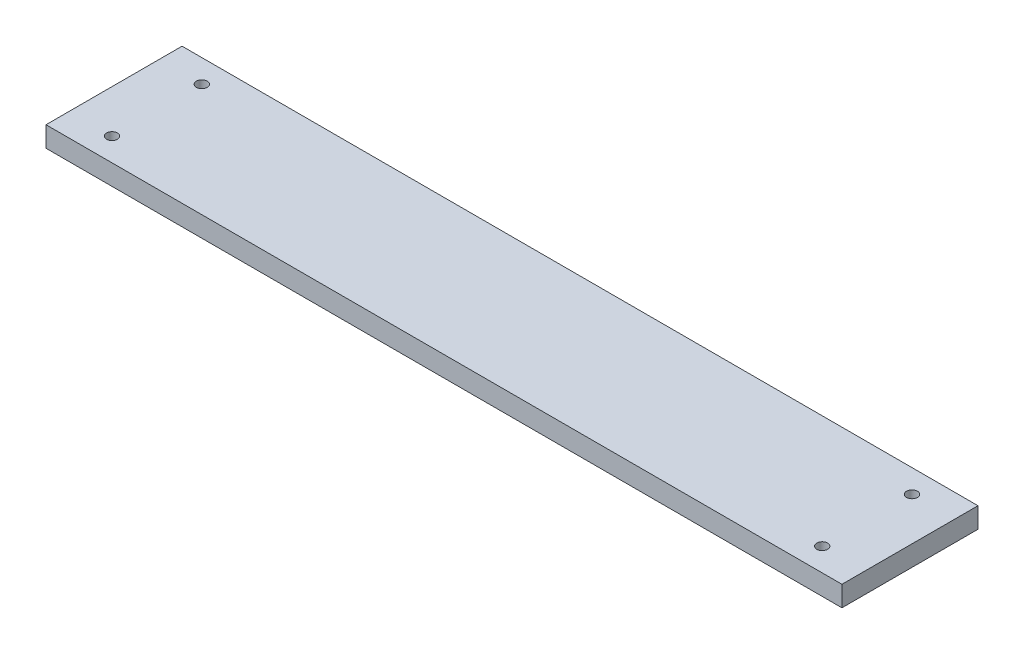
ISO-10303-21;
HEADER;
FILE_DESCRIPTION(('STEP AP214'),'2;1');
FILE_NAME('part.step','',(''),(''),'','','');
FILE_SCHEMA(('AUTOMOTIVE_DESIGN { 1 0 10303 214 1 1 1 1 }'));
ENDSEC;
DATA;
#1=APPLICATION_CONTEXT('core data for automotive mechanical design processes');
#2=APPLICATION_PROTOCOL_DEFINITION('international standard','automotive_design',2000,#1);
#3=PRODUCT_CONTEXT('',#1,'mechanical');
#4=PRODUCT('Part','Part','',(#3));
#5=PRODUCT_RELATED_PRODUCT_CATEGORY('part','',(#4));
#6=PRODUCT_DEFINITION_FORMATION('','',#4);
#7=PRODUCT_DEFINITION_CONTEXT('part definition',#1,'design');
#8=PRODUCT_DEFINITION('design','',#6,#7);
#9=PRODUCT_DEFINITION_SHAPE('','',#8);
#10=(LENGTH_UNIT() NAMED_UNIT(*) SI_UNIT(.MILLI.,.METRE.));
#11=(NAMED_UNIT(*) PLANE_ANGLE_UNIT() SI_UNIT($,.RADIAN.));
#12=(NAMED_UNIT(*) SI_UNIT($,.STERADIAN.) SOLID_ANGLE_UNIT());
#13=UNCERTAINTY_MEASURE_WITH_UNIT(LENGTH_MEASURE(1.E-05),#10,'distance_accuracy_value','');
#14=(GEOMETRIC_REPRESENTATION_CONTEXT(3) GLOBAL_UNCERTAINTY_ASSIGNED_CONTEXT((#13)) GLOBAL_UNIT_ASSIGNED_CONTEXT((#10,
#11,#12)) REPRESENTATION_CONTEXT('',''));
#15=CARTESIAN_POINT('',(0.,0.,0.));
#16=DIRECTION('',(0.,0.,1.));
#17=DIRECTION('',(1.,0.,0.));
#18=AXIS2_PLACEMENT_3D('',#15,#16,#17);
#19=CARTESIAN_POINT('',(0.,15.,0.));
#20=DIRECTION('',(0.,-1.,0.));
#21=DIRECTION('',(0.,0.,-1.));
#22=AXIS2_PLACEMENT_3D('',#19,#20,#21);
#23=PLANE('',#22);
#24=CARTESIAN_POINT('',(553.5,15.,-17.));
#25=DIRECTION('',(0.,1.,0.));
#26=DIRECTION('',(0.,0.,-1.));
#27=AXIS2_PLACEMENT_3D('',#24,#25,#26);
#28=CIRCLE('',#27,3.99999999999999);
#29=CARTESIAN_POINT('',(553.5,15.,-21.));
#30=VERTEX_POINT('',#29);
#31=EDGE_CURVE('E121',#30,#30,#28,.T.);
#32=ORIENTED_EDGE('',*,*,#31,.F.);
#33=EDGE_LOOP('',(#32));
#34=FACE_BOUND('',#33,.T.);
#35=CARTESIAN_POINT('',(31.5,15.,-83.));
#36=DIRECTION('',(0.,1.,0.));
#37=DIRECTION('',(0.,0.,1.));
#38=AXIS2_PLACEMENT_3D('',#35,#36,#37);
#39=CIRCLE('',#38,4.00000000000001);
#40=CARTESIAN_POINT('',(31.5,15.,-79.));
#41=VERTEX_POINT('',#40);
#42=EDGE_CURVE('E100',#41,#41,#39,.T.);
#43=ORIENTED_EDGE('',*,*,#42,.F.);
#44=EDGE_LOOP('',(#43));
#45=FACE_BOUND('',#44,.T.);
#46=DIRECTION('',(0.,0.,1.));
#47=VECTOR('',#46,1.);
#48=CARTESIAN_POINT('',(0.,15.,0.));
#49=LINE('',#48,#47);
#50=CARTESIAN_POINT('',(0.,15.,-100.));
#51=VERTEX_POINT('',#50);
#52=CARTESIAN_POINT('',(0.,15.,0.));
#53=VERTEX_POINT('',#52);
#54=EDGE_CURVE('E85',#51,#53,#49,.T.);
#55=ORIENTED_EDGE('',*,*,#54,.T.);
#56=DIRECTION('',(1.,0.,0.));
#57=VECTOR('',#56,1.);
#58=CARTESIAN_POINT('',(0.,15.,0.));
#59=LINE('',#58,#57);
#60=CARTESIAN_POINT('',(585.,15.,0.));
#61=VERTEX_POINT('',#60);
#62=EDGE_CURVE('E80',#53,#61,#59,.T.);
#63=ORIENTED_EDGE('',*,*,#62,.T.);
#64=DIRECTION('',(0.,0.,-1.));
#65=VECTOR('',#64,1.);
#66=CARTESIAN_POINT('',(585.,15.,0.));
#67=LINE('',#66,#65);
#68=CARTESIAN_POINT('',(585.,15.,-100.));
#69=VERTEX_POINT('',#68);
#70=EDGE_CURVE('E83',#61,#69,#67,.T.);
#71=ORIENTED_EDGE('',*,*,#70,.T.);
#72=DIRECTION('',(-1.,0.,0.));
#73=VECTOR('',#72,1.);
#74=CARTESIAN_POINT('',(0.,15.,-100.));
#75=LINE('',#74,#73);
#76=EDGE_CURVE('E50',#69,#51,#75,.T.);
#77=ORIENTED_EDGE('',*,*,#76,.T.);
#78=EDGE_LOOP('',(#55,#63,#71,#77));
#79=FACE_BOUND('',#78,.T.);
#80=CARTESIAN_POINT('',(31.5,15.,-17.));
#81=DIRECTION('',(0.,1.,0.));
#82=DIRECTION('',(0.,0.,1.));
#83=AXIS2_PLACEMENT_3D('',#80,#81,#82);
#84=CIRCLE('',#83,4.);
#85=CARTESIAN_POINT('',(31.5,15.,-13.));
#86=VERTEX_POINT('',#85);
#87=EDGE_CURVE('E115',#86,#86,#84,.T.);
#88=ORIENTED_EDGE('',*,*,#87,.F.);
#89=EDGE_LOOP('',(#88));
#90=FACE_BOUND('',#89,.T.);
#91=CARTESIAN_POINT('',(553.5,15.,-83.));
#92=DIRECTION('',(0.,1.,0.));
#93=DIRECTION('',(0.,0.,-1.));
#94=AXIS2_PLACEMENT_3D('',#91,#92,#93);
#95=CIRCLE('',#94,3.99999999999999);
#96=CARTESIAN_POINT('',(553.5,15.,-87.));
#97=VERTEX_POINT('',#96);
#98=EDGE_CURVE('E127',#97,#97,#95,.T.);
#99=ORIENTED_EDGE('',*,*,#98,.F.);
#100=EDGE_LOOP('',(#99));
#101=FACE_BOUND('',#100,.T.);
#102=ADVANCED_FACE('F33',(#34,#45,#79,#90,#101),#23,.F.);
#103=CARTESIAN_POINT('',(0.,0.,0.));
#104=DIRECTION('',(0.,-1.,0.));
#105=DIRECTION('',(0.,0.,-1.));
#106=AXIS2_PLACEMENT_3D('',#103,#104,#105);
#107=PLANE('',#106);
#108=CARTESIAN_POINT('',(554.5,0.,-49.9999999999999));
#109=DIRECTION('',(0.,-1.,0.));
#110=DIRECTION('',(0.,0.,1.));
#111=AXIS2_PLACEMENT_3D('',#108,#109,#110);
#112=CIRCLE('',#111,11.);
#113=CARTESIAN_POINT('',(554.5,0.,-38.9999999999999));
#114=VERTEX_POINT('',#113);
#115=EDGE_CURVE('E142',#114,#114,#112,.T.);
#116=ORIENTED_EDGE('',*,*,#115,.F.);
#117=EDGE_LOOP('',(#116));
#118=FACE_BOUND('',#117,.T.);
#119=CARTESIAN_POINT('',(30.5,0.,-50.));
#120=DIRECTION('',(0.,-1.,0.));
#121=DIRECTION('',(0.,0.,-1.));
#122=AXIS2_PLACEMENT_3D('',#119,#120,#121);
#123=CIRCLE('',#122,11.);
#124=CARTESIAN_POINT('',(30.5,0.,-61.));
#125=VERTEX_POINT('',#124);
#126=EDGE_CURVE('E136',#125,#125,#123,.T.);
#127=ORIENTED_EDGE('',*,*,#126,.F.);
#128=EDGE_LOOP('',(#127));
#129=FACE_BOUND('',#128,.T.);
#130=CARTESIAN_POINT('',(553.5,0.,-17.));
#131=DIRECTION('',(0.,1.,0.));
#132=DIRECTION('',(0.,0.,-1.));
#133=AXIS2_PLACEMENT_3D('',#130,#131,#132);
#134=CIRCLE('',#133,3.99999999999999);
#135=CARTESIAN_POINT('',(553.5,0.,-21.));
#136=VERTEX_POINT('',#135);
#137=EDGE_CURVE('E124',#136,#136,#134,.T.);
#138=ORIENTED_EDGE('',*,*,#137,.T.);
#139=EDGE_LOOP('',(#138));
#140=FACE_BOUND('',#139,.T.);
#141=CARTESIAN_POINT('',(31.5,0.,-83.));
#142=DIRECTION('',(0.,1.,0.));
#143=DIRECTION('',(0.,0.,1.));
#144=AXIS2_PLACEMENT_3D('',#141,#142,#143);
#145=CIRCLE('',#144,4.00000000000001);
#146=CARTESIAN_POINT('',(31.5,0.,-79.));
#147=VERTEX_POINT('',#146);
#148=EDGE_CURVE('E112',#147,#147,#145,.T.);
#149=ORIENTED_EDGE('',*,*,#148,.T.);
#150=EDGE_LOOP('',(#149));
#151=FACE_BOUND('',#150,.T.);
#152=DIRECTION('',(0.,0.,1.));
#153=VECTOR('',#152,1.);
#154=CARTESIAN_POINT('',(0.,0.,0.));
#155=LINE('',#154,#153);
#156=CARTESIAN_POINT('',(0.,0.,-100.));
#157=VERTEX_POINT('',#156);
#158=CARTESIAN_POINT('',(0.,0.,0.));
#159=VERTEX_POINT('',#158);
#160=EDGE_CURVE('E97',#157,#159,#155,.T.);
#161=ORIENTED_EDGE('',*,*,#160,.F.);
#162=DIRECTION('',(-1.,0.,0.));
#163=VECTOR('',#162,1.);
#164=CARTESIAN_POINT('',(0.,0.,-100.));
#165=LINE('',#164,#163);
#166=CARTESIAN_POINT('',(585.,0.,-100.));
#167=VERTEX_POINT('',#166);
#168=EDGE_CURVE('E73',#167,#157,#165,.T.);
#169=ORIENTED_EDGE('',*,*,#168,.F.);
#170=DIRECTION('',(0.,0.,-1.));
#171=VECTOR('',#170,1.);
#172=CARTESIAN_POINT('',(585.,0.,0.));
#173=LINE('',#172,#171);
#174=CARTESIAN_POINT('',(585.,0.,0.));
#175=VERTEX_POINT('',#174);
#176=EDGE_CURVE('E67',#175,#167,#173,.T.);
#177=ORIENTED_EDGE('',*,*,#176,.F.);
#178=DIRECTION('',(1.,0.,0.));
#179=VECTOR('',#178,1.);
#180=CARTESIAN_POINT('',(0.,0.,0.));
#181=LINE('',#180,#179);
#182=EDGE_CURVE('E89',#159,#175,#181,.T.);
#183=ORIENTED_EDGE('',*,*,#182,.F.);
#184=EDGE_LOOP('',(#161,#169,#177,#183));
#185=FACE_BOUND('',#184,.T.);
#186=CARTESIAN_POINT('',(31.5,0.,-17.));
#187=DIRECTION('',(0.,1.,0.));
#188=DIRECTION('',(0.,0.,1.));
#189=AXIS2_PLACEMENT_3D('',#186,#187,#188);
#190=CIRCLE('',#189,4.);
#191=CARTESIAN_POINT('',(31.5,0.,-13.));
#192=VERTEX_POINT('',#191);
#193=EDGE_CURVE('E118',#192,#192,#190,.T.);
#194=ORIENTED_EDGE('',*,*,#193,.T.);
#195=EDGE_LOOP('',(#194));
#196=FACE_BOUND('',#195,.T.);
#197=CARTESIAN_POINT('',(553.5,0.,-83.));
#198=DIRECTION('',(0.,1.,0.));
#199=DIRECTION('',(0.,0.,-1.));
#200=AXIS2_PLACEMENT_3D('',#197,#198,#199);
#201=CIRCLE('',#200,3.99999999999999);
#202=CARTESIAN_POINT('',(553.5,0.,-87.));
#203=VERTEX_POINT('',#202);
#204=EDGE_CURVE('E130',#203,#203,#201,.T.);
#205=ORIENTED_EDGE('',*,*,#204,.T.);
#206=EDGE_LOOP('',(#205));
#207=FACE_BOUND('',#206,.T.);
#208=ADVANCED_FACE('F108',(#118,#129,#140,#151,#185,#196,#207),#107,.T.);
#209=CARTESIAN_POINT('',(0.,15.,0.));
#210=DIRECTION('',(1.,0.,0.));
#211=DIRECTION('',(0.,0.,-1.));
#212=AXIS2_PLACEMENT_3D('',#209,#210,#211);
#213=PLANE('',#212);
#214=ORIENTED_EDGE('',*,*,#160,.T.);
#215=DIRECTION('',(0.,-1.,0.));
#216=VECTOR('',#215,1.);
#217=CARTESIAN_POINT('',(0.,15.,0.));
#218=LINE('',#217,#216);
#219=EDGE_CURVE('E11',#53,#159,#218,.T.);
#220=ORIENTED_EDGE('',*,*,#219,.F.);
#221=ORIENTED_EDGE('',*,*,#54,.F.);
#222=DIRECTION('',(0.,-1.,0.));
#223=VECTOR('',#222,1.);
#224=CARTESIAN_POINT('',(0.,15.,-100.));
#225=LINE('',#224,#223);
#226=EDGE_CURVE('E93',#51,#157,#225,.T.);
#227=ORIENTED_EDGE('',*,*,#226,.T.);
#228=EDGE_LOOP('',(#214,#220,#221,#227));
#229=FACE_BOUND('',#228,.T.);
#230=ADVANCED_FACE('F35',(#229),#213,.F.);
#231=CARTESIAN_POINT('',(0.,15.,0.));
#232=DIRECTION('',(0.,0.,-1.));
#233=DIRECTION('',(-1.,0.,0.));
#234=AXIS2_PLACEMENT_3D('',#231,#232,#233);
#235=PLANE('',#234);
#236=ORIENTED_EDGE('',*,*,#182,.T.);
#237=DIRECTION('',(0.,-1.,0.));
#238=VECTOR('',#237,1.);
#239=CARTESIAN_POINT('',(585.,15.,0.));
#240=LINE('',#239,#238);
#241=EDGE_CURVE('E42',#61,#175,#240,.T.);
#242=ORIENTED_EDGE('',*,*,#241,.F.);
#243=ORIENTED_EDGE('',*,*,#62,.F.);
#244=ORIENTED_EDGE('',*,*,#219,.T.);
#245=EDGE_LOOP('',(#236,#242,#243,#244));
#246=FACE_BOUND('',#245,.T.);
#247=ADVANCED_FACE('F88',(#246),#235,.F.);
#248=CARTESIAN_POINT('',(585.,15.,0.));
#249=DIRECTION('',(-1.,0.,0.));
#250=DIRECTION('',(0.,0.,1.));
#251=AXIS2_PLACEMENT_3D('',#248,#249,#250);
#252=PLANE('',#251);
#253=ORIENTED_EDGE('',*,*,#176,.T.);
#254=DIRECTION('',(0.,-1.,0.));
#255=VECTOR('',#254,1.);
#256=CARTESIAN_POINT('',(585.,15.,-100.));
#257=LINE('',#256,#255);
#258=EDGE_CURVE('E90',#69,#167,#257,.T.);
#259=ORIENTED_EDGE('',*,*,#258,.F.);
#260=ORIENTED_EDGE('',*,*,#70,.F.);
#261=ORIENTED_EDGE('',*,*,#241,.T.);
#262=EDGE_LOOP('',(#253,#259,#260,#261));
#263=FACE_BOUND('',#262,.T.);
#264=ADVANCED_FACE('F91',(#263),#252,.F.);
#265=CARTESIAN_POINT('',(0.,15.,-100.));
#266=DIRECTION('',(0.,0.,1.));
#267=DIRECTION('',(1.,0.,0.));
#268=AXIS2_PLACEMENT_3D('',#265,#266,#267);
#269=PLANE('',#268);
#270=ORIENTED_EDGE('',*,*,#168,.T.);
#271=ORIENTED_EDGE('',*,*,#226,.F.);
#272=ORIENTED_EDGE('',*,*,#76,.F.);
#273=ORIENTED_EDGE('',*,*,#258,.T.);
#274=EDGE_LOOP('',(#270,#271,#272,#273));
#275=FACE_BOUND('',#274,.T.);
#276=ADVANCED_FACE('F105',(#275),#269,.F.);
#277=CARTESIAN_POINT('',(31.5,15.,-83.));
#278=DIRECTION('',(0.,-1.,0.));
#279=DIRECTION('',(0.,0.,-1.));
#280=AXIS2_PLACEMENT_3D('',#277,#278,#279);
#281=CYLINDRICAL_SURFACE('',#280,4.00000000000001);
#282=ORIENTED_EDGE('',*,*,#42,.T.);
#283=EDGE_LOOP('',(#282));
#284=FACE_BOUND('',#283,.T.);
#285=ORIENTED_EDGE('',*,*,#148,.F.);
#286=EDGE_LOOP('',(#285));
#287=FACE_BOUND('',#286,.T.);
#288=ADVANCED_FACE('F166',(#284,#287),#281,.F.);
#289=CARTESIAN_POINT('',(31.5,15.,-17.));
#290=DIRECTION('',(0.,-1.,0.));
#291=DIRECTION('',(0.,0.,-1.));
#292=AXIS2_PLACEMENT_3D('',#289,#290,#291);
#293=CYLINDRICAL_SURFACE('',#292,4.);
#294=ORIENTED_EDGE('',*,*,#87,.T.);
#295=EDGE_LOOP('',(#294));
#296=FACE_BOUND('',#295,.T.);
#297=ORIENTED_EDGE('',*,*,#193,.F.);
#298=EDGE_LOOP('',(#297));
#299=FACE_BOUND('',#298,.T.);
#300=ADVANCED_FACE('F168',(#296,#299),#293,.F.);
#301=CARTESIAN_POINT('',(553.5,15.,-17.));
#302=DIRECTION('',(0.,-1.,0.));
#303=DIRECTION('',(0.,0.,-1.));
#304=AXIS2_PLACEMENT_3D('',#301,#302,#303);
#305=CYLINDRICAL_SURFACE('',#304,3.99999999999999);
#306=ORIENTED_EDGE('',*,*,#31,.T.);
#307=EDGE_LOOP('',(#306));
#308=FACE_BOUND('',#307,.T.);
#309=ORIENTED_EDGE('',*,*,#137,.F.);
#310=EDGE_LOOP('',(#309));
#311=FACE_BOUND('',#310,.T.);
#312=ADVANCED_FACE('F175',(#308,#311),#305,.F.);
#313=CARTESIAN_POINT('',(553.5,15.,-83.));
#314=DIRECTION('',(0.,-1.,0.));
#315=DIRECTION('',(0.,0.,-1.));
#316=AXIS2_PLACEMENT_3D('',#313,#314,#315);
#317=CYLINDRICAL_SURFACE('',#316,3.99999999999999);
#318=ORIENTED_EDGE('',*,*,#98,.T.);
#319=EDGE_LOOP('',(#318));
#320=FACE_BOUND('',#319,.T.);
#321=ORIENTED_EDGE('',*,*,#204,.F.);
#322=EDGE_LOOP('',(#321));
#323=FACE_BOUND('',#322,.T.);
#324=ADVANCED_FACE('F205',(#320,#323),#317,.F.);
#325=CARTESIAN_POINT('',(30.5,7.,-50.));
#326=DIRECTION('',(0.,-1.,0.));
#327=DIRECTION('',(0.,0.,-1.));
#328=AXIS2_PLACEMENT_3D('',#325,#326,#327);
#329=CYLINDRICAL_SURFACE('',#328,11.);
#330=CARTESIAN_POINT('',(30.5,7.,-50.));
#331=DIRECTION('',(0.,-1.,0.));
#332=DIRECTION('',(0.,0.,-1.));
#333=AXIS2_PLACEMENT_3D('',#330,#331,#332);
#334=CIRCLE('',#333,11.);
#335=CARTESIAN_POINT('',(30.5,7.,-61.));
#336=VERTEX_POINT('',#335);
#337=EDGE_CURVE('E133',#336,#336,#334,.T.);
#338=ORIENTED_EDGE('',*,*,#337,.F.);
#339=EDGE_LOOP('',(#338));
#340=FACE_BOUND('',#339,.T.);
#341=ORIENTED_EDGE('',*,*,#126,.T.);
#342=EDGE_LOOP('',(#341));
#343=FACE_BOUND('',#342,.T.);
#344=ADVANCED_FACE('F210',(#340,#343),#329,.F.);
#345=CARTESIAN_POINT('',(30.5,7.,-50.));
#346=DIRECTION('',(0.,-1.,0.));
#347=DIRECTION('',(0.,0.,-1.));
#348=AXIS2_PLACEMENT_3D('',#345,#346,#347);
#349=PLANE('',#348);
#350=ORIENTED_EDGE('',*,*,#337,.T.);
#351=EDGE_LOOP('',(#350));
#352=FACE_BOUND('',#351,.T.);
#353=ADVANCED_FACE('F153',(#352),#349,.T.);
#354=CARTESIAN_POINT('',(554.5,7.,-49.9999999999999));
#355=DIRECTION('',(0.,-1.,0.));
#356=DIRECTION('',(0.,0.,-1.));
#357=AXIS2_PLACEMENT_3D('',#354,#355,#356);
#358=CYLINDRICAL_SURFACE('',#357,11.);
#359=CARTESIAN_POINT('',(554.5,7.,-49.9999999999999));
#360=DIRECTION('',(0.,-1.,0.));
#361=DIRECTION('',(0.,0.,1.));
#362=AXIS2_PLACEMENT_3D('',#359,#360,#361);
#363=CIRCLE('',#362,11.);
#364=CARTESIAN_POINT('',(554.5,7.,-38.9999999999999));
#365=VERTEX_POINT('',#364);
#366=EDGE_CURVE('E139',#365,#365,#363,.T.);
#367=ORIENTED_EDGE('',*,*,#366,.F.);
#368=EDGE_LOOP('',(#367));
#369=FACE_BOUND('',#368,.T.);
#370=ORIENTED_EDGE('',*,*,#115,.T.);
#371=EDGE_LOOP('',(#370));
#372=FACE_BOUND('',#371,.T.);
#373=ADVANCED_FACE('F150',(#369,#372),#358,.F.);
#374=CARTESIAN_POINT('',(554.5,7.,-49.9999999999999));
#375=DIRECTION('',(0.,1.,0.));
#376=DIRECTION('',(0.,0.,1.));
#377=AXIS2_PLACEMENT_3D('',#374,#375,#376);
#378=PLANE('',#377);
#379=ORIENTED_EDGE('',*,*,#366,.T.);
#380=EDGE_LOOP('',(#379));
#381=FACE_BOUND('',#380,.T.);
#382=ADVANCED_FACE('F148',(#381),#378,.F.);
#383=CLOSED_SHELL('',(#102,#208,#230,#247,#264,#276,#288,#300,#312,#324,#344,#353,#373,#382));
#384=MANIFOLD_SOLID_BREP('B2',#383);
#385=ADVANCED_BREP_SHAPE_REPRESENTATION('',(#18,#384),#14);
#386=SHAPE_DEFINITION_REPRESENTATION(#9,#385);
ENDSEC;
END-ISO-10303-21;
